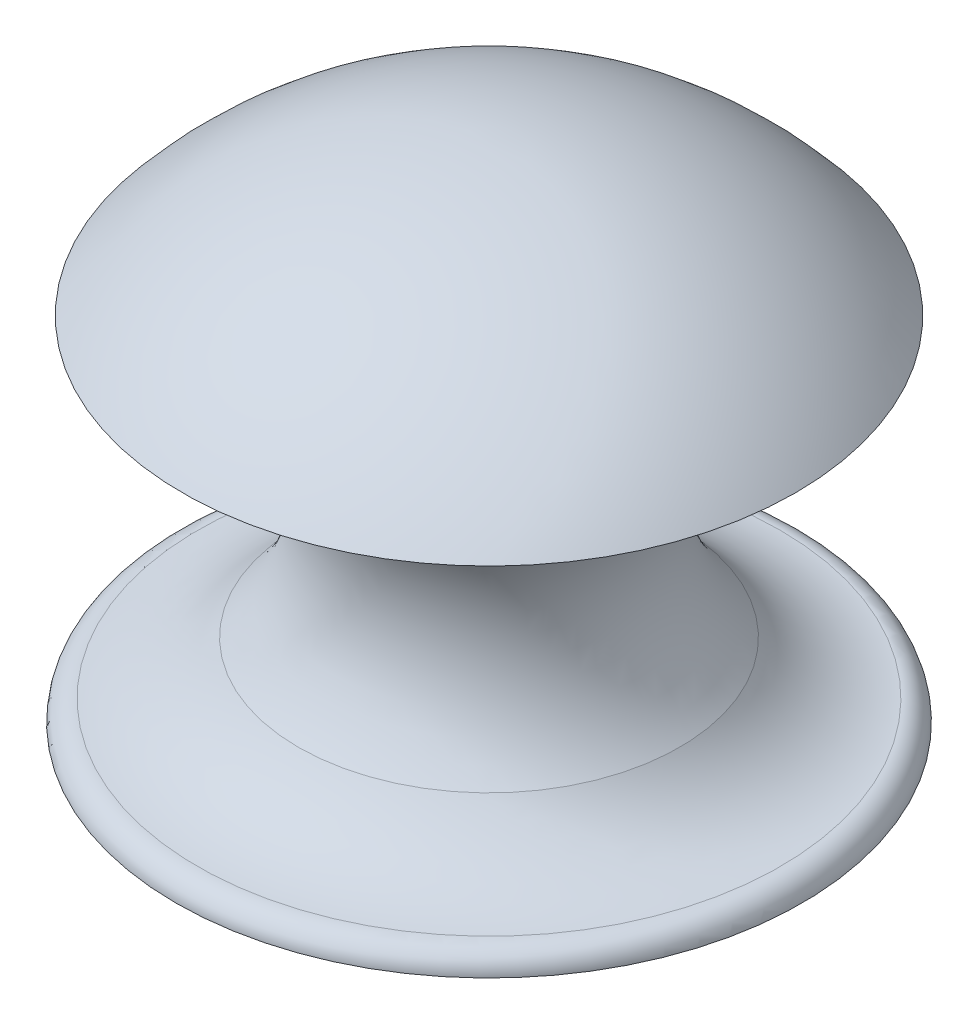
ISO-10303-21;
HEADER;
FILE_DESCRIPTION(('STEP AP214'),'2;1');
FILE_NAME('part.step','',(''),(''),'','','');
FILE_SCHEMA(('AUTOMOTIVE_DESIGN { 1 0 10303 214 1 1 1 1 }'));
ENDSEC;
DATA;
#1=APPLICATION_CONTEXT('core data for automotive mechanical design processes');
#2=APPLICATION_PROTOCOL_DEFINITION('international standard','automotive_design',2000,#1);
#3=PRODUCT_CONTEXT('',#1,'mechanical');
#4=PRODUCT('Part','Part','',(#3));
#5=PRODUCT_RELATED_PRODUCT_CATEGORY('part','',(#4));
#6=PRODUCT_DEFINITION_FORMATION('','',#4);
#7=PRODUCT_DEFINITION_CONTEXT('part definition',#1,'design');
#8=PRODUCT_DEFINITION('design','',#6,#7);
#9=PRODUCT_DEFINITION_SHAPE('','',#8);
#10=(LENGTH_UNIT() NAMED_UNIT(*) SI_UNIT(.MILLI.,.METRE.));
#11=(NAMED_UNIT(*) PLANE_ANGLE_UNIT() SI_UNIT($,.RADIAN.));
#12=(NAMED_UNIT(*) SI_UNIT($,.STERADIAN.) SOLID_ANGLE_UNIT());
#13=UNCERTAINTY_MEASURE_WITH_UNIT(LENGTH_MEASURE(1.E-05),#10,'distance_accuracy_value','');
#14=(GEOMETRIC_REPRESENTATION_CONTEXT(3) GLOBAL_UNCERTAINTY_ASSIGNED_CONTEXT((#13)) GLOBAL_UNIT_ASSIGNED_CONTEXT((#10,
#11,#12)) REPRESENTATION_CONTEXT('',''));
#15=CARTESIAN_POINT('',(0.,0.,0.));
#16=DIRECTION('',(0.,0.,1.));
#17=DIRECTION('',(1.,0.,0.));
#18=AXIS2_PLACEMENT_3D('',#15,#16,#17);
#19=CARTESIAN_POINT('',(0.,0.,0.));
#20=DIRECTION('',(0.,-1.,0.));
#21=DIRECTION('',(0.,0.,-1.));
#22=AXIS2_PLACEMENT_3D('',#19,#20,#21);
#23=PLANE('',#22);
#24=CARTESIAN_POINT('',(0.,0.,0.));
#25=DIRECTION('',(0.,-1.,0.));
#26=DIRECTION('',(0.,0.,-1.));
#27=AXIS2_PLACEMENT_3D('',#24,#25,#26);
#28=CIRCLE('',#27,1.5);
#29=CARTESIAN_POINT('',(0.,0.,-1.5));
#30=VERTEX_POINT('',#29);
#31=EDGE_CURVE('E57',#30,#30,#28,.T.);
#32=ORIENTED_EDGE('',*,*,#31,.F.);
#33=EDGE_LOOP('',(#32));
#34=FACE_BOUND('',#33,.T.);
#35=CARTESIAN_POINT('',(0.,0.,0.));
#36=DIRECTION('',(0.,-1.,0.));
#37=DIRECTION('',(0.,0.,-1.));
#38=AXIS2_PLACEMENT_3D('',#35,#36,#37);
#39=CIRCLE('',#38,17.);
#40=CARTESIAN_POINT('',(0.,0.,-17.));
#41=VERTEX_POINT('',#40);
#42=EDGE_CURVE('E10',#41,#41,#39,.T.);
#43=ORIENTED_EDGE('',*,*,#42,.T.);
#44=EDGE_LOOP('',(#43));
#45=FACE_BOUND('',#44,.T.);
#46=ADVANCED_FACE('F37',(#34,#45),#23,.T.);
#47=CARTESIAN_POINT('',(0.,-0.0154958831516992,0.));
#48=DIRECTION('',(0.,-1.,0.));
#49=DIRECTION('',(0.,0.,-1.));
#50=AXIS2_PLACEMENT_3D('',#47,#48,#49);
#51=TOROIDAL_SURFACE('',#50,15.8445141059733,1.15558979473221);
#52=CARTESIAN_POINT('',(0.,1.13999001087496,0.));
#53=DIRECTION('',(0.,-1.,0.));
#54=DIRECTION('',(0.,0.,-1.));
#55=AXIS2_PLACEMENT_3D('',#52,#53,#54);
#56=CIRCLE('',#55,15.8290182228217);
#57=CARTESIAN_POINT('',(0.,1.13999001087496,-15.8290182228217));
#58=VERTEX_POINT('',#57);
#59=EDGE_CURVE('E43',#58,#58,#56,.T.);
#60=ORIENTED_EDGE('',*,*,#59,.T.);
#61=EDGE_LOOP('',(#60));
#62=FACE_BOUND('',#61,.T.);
#63=ORIENTED_EDGE('',*,*,#42,.F.);
#64=EDGE_LOOP('',(#63));
#65=FACE_BOUND('',#64,.T.);
#66=ADVANCED_FACE('F73',(#62,#65),#51,.T.);
#67=CARTESIAN_POINT('',(0.,8.77301429082481,0.));
#68=DIRECTION('',(0.,-1.,0.));
#69=DIRECTION('',(0.,0.,-1.));
#70=AXIS2_PLACEMENT_3D('',#67,#68,#69);
#71=TOROIDAL_SURFACE('',#70,16.3462637177312,7.65052956077605);
#72=CARTESIAN_POINT('',(0.,4.0144076447365,0.));
#73=DIRECTION('',(0.,-1.,0.));
#74=DIRECTION('',(0.,0.,-1.));
#75=AXIS2_PLACEMENT_3D('',#72,#73,#74);
#76=CIRCLE('',#75,10.3557491030998);
#77=CARTESIAN_POINT('',(0.,4.0144076447365,-10.3557491030998));
#78=VERTEX_POINT('',#77);
#79=EDGE_CURVE('E47',#78,#78,#76,.T.);
#80=ORIENTED_EDGE('',*,*,#79,.T.);
#81=EDGE_LOOP('',(#80));
#82=FACE_BOUND('',#81,.T.);
#83=ORIENTED_EDGE('',*,*,#59,.F.);
#84=EDGE_LOOP('',(#83));
#85=FACE_BOUND('',#84,.T.);
#86=ADVANCED_FACE('F78',(#82,#85),#71,.F.);
#87=CARTESIAN_POINT('',(0.,10.2667779201724,0.));
#88=DIRECTION('',(0.,-1.,0.));
#89=DIRECTION('',(0.,0.,-1.));
#90=AXIS2_PLACEMENT_3D('',#87,#88,#89);
#91=TOROIDAL_SURFACE('',#90,16.6663882156308,8.88348468056091);
#92=CARTESIAN_POINT('',(0.,19.1502625942905,0.));
#93=DIRECTION('',(0.,-1.,0.));
#94=DIRECTION('',(0.,0.,-1.));
#95=AXIS2_PLACEMENT_3D('',#92,#93,#94);
#96=CIRCLE('',#95,16.6660498828017);
#97=CARTESIAN_POINT('',(0.,19.1502625942905,-16.6660498828017));
#98=VERTEX_POINT('',#97);
#99=EDGE_CURVE('E51',#98,#98,#96,.T.);
#100=ORIENTED_EDGE('',*,*,#99,.T.);
#101=EDGE_LOOP('',(#100));
#102=FACE_BOUND('',#101,.T.);
#103=ORIENTED_EDGE('',*,*,#79,.F.);
#104=EDGE_LOOP('',(#103));
#105=FACE_BOUND('',#104,.T.);
#106=ADVANCED_FACE('F82',(#102,#105),#91,.F.);
#107=CARTESIAN_POINT('',(0.,5.38299687657149,0.));
#108=DIRECTION('',(0.,-1.,0.));
#109=DIRECTION('',(1.,0.,0.));
#110=AXIS2_PLACEMENT_3D('',#107,#108,#109);
#111=SPHERICAL_SURFACE('',#110,21.6170031234285);
#112=ORIENTED_EDGE('',*,*,#99,.F.);
#113=EDGE_LOOP('',(#112));
#114=FACE_BOUND('',#113,.T.);
#115=ADVANCED_FACE('F68',(#114),#111,.T.);
#116=CARTESIAN_POINT('',(0.,13.,0.));
#117=DIRECTION('',(0.,-1.,0.));
#118=DIRECTION('',(0.,0.,-1.));
#119=AXIS2_PLACEMENT_3D('',#116,#117,#118);
#120=CYLINDRICAL_SURFACE('',#119,1.5);
#121=CARTESIAN_POINT('',(0.,13.,0.));
#122=DIRECTION('',(0.,-1.,0.));
#123=DIRECTION('',(0.,0.,-1.));
#124=AXIS2_PLACEMENT_3D('',#121,#122,#123);
#125=CIRCLE('',#124,1.5);
#126=CARTESIAN_POINT('',(0.,13.,-1.5));
#127=VERTEX_POINT('',#126);
#128=EDGE_CURVE('E56',#127,#127,#125,.T.);
#129=ORIENTED_EDGE('',*,*,#128,.F.);
#130=EDGE_LOOP('',(#129));
#131=FACE_BOUND('',#130,.T.);
#132=ORIENTED_EDGE('',*,*,#31,.T.);
#133=EDGE_LOOP('',(#132));
#134=FACE_BOUND('',#133,.T.);
#135=ADVANCED_FACE('F65',(#131,#134),#120,.F.);
#136=CARTESIAN_POINT('',(0.,13.,0.));
#137=DIRECTION('',(0.,-1.,0.));
#138=DIRECTION('',(0.,0.,-1.));
#139=AXIS2_PLACEMENT_3D('',#136,#137,#138);
#140=PLANE('',#139);
#141=ORIENTED_EDGE('',*,*,#128,.T.);
#142=EDGE_LOOP('',(#141));
#143=FACE_BOUND('',#142,.T.);
#144=ADVANCED_FACE('F63',(#143),#140,.T.);
#145=CLOSED_SHELL('',(#46,#66,#86,#106,#115,#135,#144));
#146=MANIFOLD_SOLID_BREP('B2',#145);
#147=ADVANCED_BREP_SHAPE_REPRESENTATION('',(#18,#146),#14);
#148=SHAPE_DEFINITION_REPRESENTATION(#9,#147);
ENDSEC;
END-ISO-10303-21;
